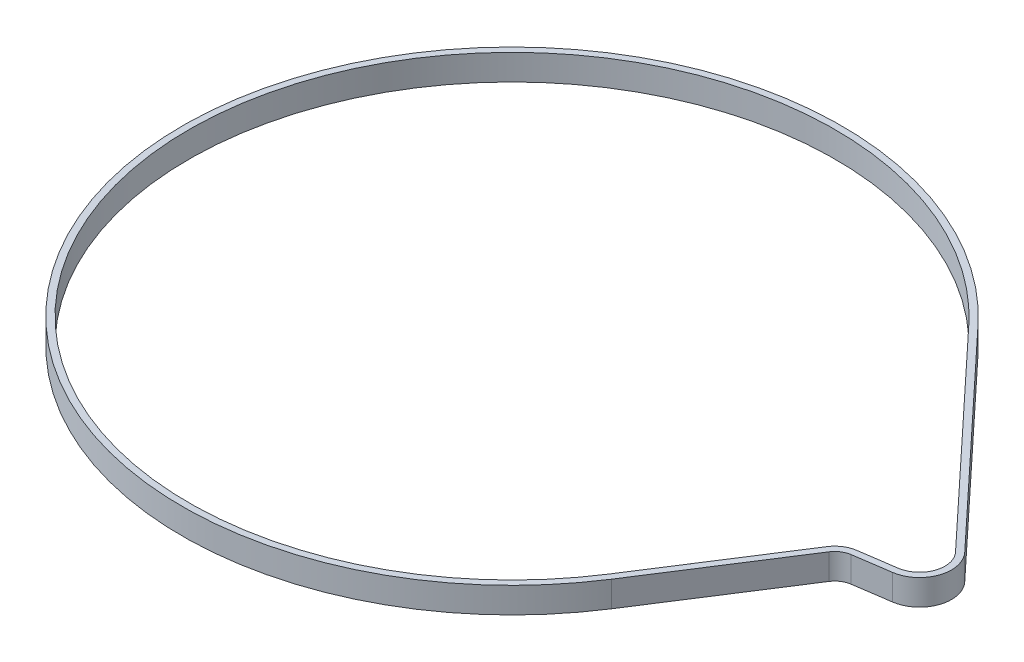
ISO-10303-21;
HEADER;
FILE_DESCRIPTION(('STEP AP214'),'2;1');
FILE_NAME('part.step','',(''),(''),'','','');
FILE_SCHEMA(('AUTOMOTIVE_DESIGN { 1 0 10303 214 1 1 1 1 }'));
ENDSEC;
DATA;
#1=APPLICATION_CONTEXT('core data for automotive mechanical design processes');
#2=APPLICATION_PROTOCOL_DEFINITION('international standard','automotive_design',2000,#1);
#3=PRODUCT_CONTEXT('',#1,'mechanical');
#4=PRODUCT('Part','Part','',(#3));
#5=PRODUCT_RELATED_PRODUCT_CATEGORY('part','',(#4));
#6=PRODUCT_DEFINITION_FORMATION('','',#4);
#7=PRODUCT_DEFINITION_CONTEXT('part definition',#1,'design');
#8=PRODUCT_DEFINITION('design','',#6,#7);
#9=PRODUCT_DEFINITION_SHAPE('','',#8);
#10=(LENGTH_UNIT() NAMED_UNIT(*) SI_UNIT(.MILLI.,.METRE.));
#11=(NAMED_UNIT(*) PLANE_ANGLE_UNIT() SI_UNIT($,.RADIAN.));
#12=(NAMED_UNIT(*) SI_UNIT($,.STERADIAN.) SOLID_ANGLE_UNIT());
#13=UNCERTAINTY_MEASURE_WITH_UNIT(LENGTH_MEASURE(1.E-05),#10,'distance_accuracy_value','');
#14=(GEOMETRIC_REPRESENTATION_CONTEXT(3) GLOBAL_UNCERTAINTY_ASSIGNED_CONTEXT((#13)) GLOBAL_UNIT_ASSIGNED_CONTEXT((#10,
#11,#12)) REPRESENTATION_CONTEXT('',''));
#15=CARTESIAN_POINT('',(0.,0.,0.));
#16=DIRECTION('',(0.,0.,1.));
#17=DIRECTION('',(1.,0.,0.));
#18=AXIS2_PLACEMENT_3D('',#15,#16,#17);
#19=CARTESIAN_POINT('',(158.877710673316,15.,102.032603113625));
#20=DIRECTION('',(-0.841426681760097,0.,-0.540371297555849));
#21=DIRECTION('',(-0.540371297555849,0.,0.841426681760097));
#22=AXIS2_PLACEMENT_3D('',#19,#20,#21);
#23=PLANE('',#22);
#24=DIRECTION('',(-0.540371297555849,0.,0.841426681760097));
#25=VECTOR('',#24,1.);
#26=CARTESIAN_POINT('',(208.605573561715,15.,24.6000102826151));
#27=LINE('',#26,#25);
#28=CARTESIAN_POINT('',(208.605573561715,15.,24.6000102826151));
#29=VERTEX_POINT('',#28);
#30=CARTESIAN_POINT('',(158.877710673316,15.,102.032603113625));
#31=VERTEX_POINT('',#30);
#32=EDGE_CURVE('E146',#29,#31,#27,.T.);
#33=ORIENTED_EDGE('',*,*,#32,.F.);
#34=DIRECTION('',(0.,-1.,0.));
#35=VECTOR('',#34,1.);
#36=CARTESIAN_POINT('',(208.605573561715,15.,24.600010282615));
#37=LINE('',#36,#35);
#38=CARTESIAN_POINT('',(208.605573561715,0.,24.6000102826151));
#39=VERTEX_POINT('',#38);
#40=EDGE_CURVE('E131',#39,#29,#37,.F.);
#41=ORIENTED_EDGE('',*,*,#40,.F.);
#42=DIRECTION('',(-0.540371297555849,0.,0.841426681760097));
#43=VECTOR('',#42,1.);
#44=CARTESIAN_POINT('',(208.605573561715,0.,24.6000102826151));
#45=LINE('',#44,#43);
#46=CARTESIAN_POINT('',(158.877710673316,0.,102.032603113625));
#47=VERTEX_POINT('',#46);
#48=EDGE_CURVE('E174',#39,#47,#45,.T.);
#49=ORIENTED_EDGE('',*,*,#48,.T.);
#50=DIRECTION('',(0.,-1.,0.));
#51=VECTOR('',#50,1.);
#52=CARTESIAN_POINT('',(158.877710673316,15.,102.032603113625));
#53=LINE('',#52,#51);
#54=EDGE_CURVE('E148',#47,#31,#53,.F.);
#55=ORIENTED_EDGE('',*,*,#54,.T.);
#56=EDGE_LOOP('',(#33,#41,#49,#55));
#57=FACE_BOUND('',#56,.T.);
#58=ADVANCED_FACE('F24',(#57),#23,.T.);
#59=CARTESIAN_POINT('',(0.,15.,0.));
#60=DIRECTION('',(0.,-1.,0.));
#61=DIRECTION('',(0.,0.,-1.));
#62=AXIS2_PLACEMENT_3D('',#59,#60,#61);
#63=CYLINDRICAL_SURFACE('',#62,188.819435035);
#64=CARTESIAN_POINT('',(0.,15.,0.));
#65=DIRECTION('',(0.,-1.,0.));
#66=DIRECTION('',(0.,0.,-1.));
#67=AXIS2_PLACEMENT_3D('',#64,#65,#66);
#68=CIRCLE('',#67,188.819435035);
#69=CARTESIAN_POINT('',(137.940623881372,15.,-128.938602947893));
#70=VERTEX_POINT('',#69);
#71=EDGE_CURVE('E152',#31,#70,#68,.T.);
#72=ORIENTED_EDGE('',*,*,#71,.F.);
#73=ORIENTED_EDGE('',*,*,#54,.F.);
#74=CARTESIAN_POINT('',(0.,0.,0.));
#75=DIRECTION('',(0.,-1.,0.));
#76=DIRECTION('',(0.,0.,-1.));
#77=AXIS2_PLACEMENT_3D('',#74,#75,#76);
#78=CIRCLE('',#77,188.819435035);
#79=CARTESIAN_POINT('',(137.940623881372,0.,-128.938602947893));
#80=VERTEX_POINT('',#79);
#81=EDGE_CURVE('E212',#47,#80,#78,.T.);
#82=ORIENTED_EDGE('',*,*,#81,.T.);
#83=DIRECTION('',(0.,1.,0.));
#84=VECTOR('',#83,1.);
#85=CARTESIAN_POINT('',(137.940623881373,15.,-128.938602947892));
#86=LINE('',#85,#84);
#87=EDGE_CURVE('E192',#80,#70,#86,.T.);
#88=ORIENTED_EDGE('',*,*,#87,.T.);
#89=EDGE_LOOP('',(#72,#73,#82,#88));
#90=FACE_BOUND('',#89,.T.);
#91=ADVANCED_FACE('F286',(#90),#63,.F.);
#92=CARTESIAN_POINT('',(137.940623881371,15.,-128.938602947894));
#93=DIRECTION('',(0.730542509333333,0.,-0.6828672213959));
#94=DIRECTION('',(-0.6828672213959,0.,-0.730542509333333));
#95=AXIS2_PLACEMENT_3D('',#92,#93,#94);
#96=PLANE('',#95);
#97=DIRECTION('',(0.,-1.,0.));
#98=VECTOR('',#97,1.);
#99=CARTESIAN_POINT('',(248.980131146184,15.,-10.1467240427216));
#100=LINE('',#99,#98);
#101=CARTESIAN_POINT('',(248.980131146184,0.,-10.1467240427217));
#102=VERTEX_POINT('',#101);
#103=CARTESIAN_POINT('',(248.980131146184,15.,-10.1467240427217));
#104=VERTEX_POINT('',#103);
#105=EDGE_CURVE('E189',#102,#104,#100,.F.);
#106=ORIENTED_EDGE('',*,*,#105,.T.);
#107=DIRECTION('',(0.6828672213959,0.,0.730542509333333));
#108=VECTOR('',#107,1.);
#109=CARTESIAN_POINT('',(137.940623881373,15.,-128.938602947892));
#110=LINE('',#109,#108);
#111=EDGE_CURVE('E226',#70,#104,#110,.T.);
#112=ORIENTED_EDGE('',*,*,#111,.F.);
#113=ORIENTED_EDGE('',*,*,#87,.F.);
#114=DIRECTION('',(0.6828672213959,0.,0.730542509333333));
#115=VECTOR('',#114,1.);
#116=CARTESIAN_POINT('',(137.940623881373,0.,-128.938602947892));
#117=LINE('',#116,#115);
#118=EDGE_CURVE('E211',#80,#102,#117,.T.);
#119=ORIENTED_EDGE('',*,*,#118,.T.);
#120=EDGE_LOOP('',(#106,#112,#113,#119));
#121=FACE_BOUND('',#120,.T.);
#122=ADVANCED_FACE('F299',(#121),#96,.F.);
#123=CARTESIAN_POINT('',(238.125,15.,0.));
#124=DIRECTION('',(0.,-1.,0.));
#125=DIRECTION('',(0.,0.,-1.));
#126=AXIS2_PLACEMENT_3D('',#123,#124,#125);
#127=CYLINDRICAL_SURFACE('',#126,14.8589999999999);
#128=DIRECTION('',(0.,1.,0.));
#129=VECTOR('',#128,1.);
#130=CARTESIAN_POINT('',(240.272744877639,15.,14.7029613663566));
#131=LINE('',#130,#129);
#132=CARTESIAN_POINT('',(240.272744877639,15.,14.7029613663566));
#133=VERTEX_POINT('',#132);
#134=CARTESIAN_POINT('',(240.272744877639,0.,14.7029613663566));
#135=VERTEX_POINT('',#134);
#136=EDGE_CURVE('E142',#133,#135,#131,.F.);
#137=ORIENTED_EDGE('',*,*,#136,.F.);
#138=CARTESIAN_POINT('',(238.125,15.,0.));
#139=DIRECTION('',(0.,-1.,0.));
#140=DIRECTION('',(0.,0.,-1.));
#141=AXIS2_PLACEMENT_3D('',#138,#139,#140);
#142=CIRCLE('',#141,14.8589999999999);
#143=EDGE_CURVE('E224',#104,#133,#142,.T.);
#144=ORIENTED_EDGE('',*,*,#143,.F.);
#145=ORIENTED_EDGE('',*,*,#105,.F.);
#146=CARTESIAN_POINT('',(238.125,0.,0.));
#147=DIRECTION('',(0.,-1.,0.));
#148=DIRECTION('',(0.,0.,-1.));
#149=AXIS2_PLACEMENT_3D('',#146,#147,#148);
#150=CIRCLE('',#149,14.8589999999999);
#151=EDGE_CURVE('E208',#102,#135,#150,.T.);
#152=ORIENTED_EDGE('',*,*,#151,.T.);
#153=EDGE_LOOP('',(#137,#144,#145,#152));
#154=FACE_BOUND('',#153,.T.);
#155=ADVANCED_FACE('F307',(#154),#127,.F.);
#156=CARTESIAN_POINT('',(7.1227234145852,15.,48.7605060909451));
#157=DIRECTION('',(-0.144541683669059,0.,-0.989498712319583));
#158=DIRECTION('',(-0.989498712319583,0.,0.144541683669059));
#159=AXIS2_PLACEMENT_3D('',#156,#157,#158);
#160=PLANE('',#159);
#161=DIRECTION('',(-0.989498712319584,0.,0.144541683669059));
#162=VECTOR('',#161,1.);
#163=CARTESIAN_POINT('',(240.272744877639,15.,14.7029613663566));
#164=LINE('',#163,#162);
#165=CARTESIAN_POINT('',(219.181848735244,15.,17.7838280724533));
#166=VERTEX_POINT('',#165);
#167=EDGE_CURVE('E156',#133,#166,#164,.T.);
#168=ORIENTED_EDGE('',*,*,#167,.F.);
#169=ORIENTED_EDGE('',*,*,#136,.T.);
#170=DIRECTION('',(-0.989498712319584,0.,0.144541683669059));
#171=VECTOR('',#170,1.);
#172=CARTESIAN_POINT('',(240.272744877639,0.,14.7029613663566));
#173=LINE('',#172,#171);
#174=CARTESIAN_POINT('',(219.181848735244,0.,17.7838280724533));
#175=VERTEX_POINT('',#174);
#176=EDGE_CURVE('E207',#135,#175,#173,.T.);
#177=ORIENTED_EDGE('',*,*,#176,.T.);
#178=DIRECTION('',(0.,-1.,0.));
#179=VECTOR('',#178,1.);
#180=CARTESIAN_POINT('',(219.181848735244,15.,17.7838280724533));
#181=LINE('',#180,#179);
#182=EDGE_CURVE('E125',#166,#175,#181,.T.);
#183=ORIENTED_EDGE('',*,*,#182,.F.);
#184=EDGE_LOOP('',(#168,#169,#177,#183));
#185=FACE_BOUND('',#184,.T.);
#186=ADVANCED_FACE('F318',(#185),#160,.T.);
#187=CARTESIAN_POINT('',(221.375485597447,15.,32.8009552799714));
#188=DIRECTION('',(0.,-1.,0.));
#189=DIRECTION('',(0.,0.,-1.));
#190=AXIS2_PLACEMENT_3D('',#187,#188,#189);
#191=CYLINDRICAL_SURFACE('',#190,15.1765);
#192=CARTESIAN_POINT('',(221.375485597447,15.,32.8009552799714));
#193=DIRECTION('',(0.,-1.,0.));
#194=DIRECTION('',(0.,0.,-1.));
#195=AXIS2_PLACEMENT_3D('',#192,#193,#194);
#196=CIRCLE('',#195,15.1765);
#197=EDGE_CURVE('E27',#166,#29,#196,.F.);
#198=ORIENTED_EDGE('',*,*,#197,.F.);
#199=ORIENTED_EDGE('',*,*,#182,.T.);
#200=CARTESIAN_POINT('',(221.375485597447,0.,32.8009552799714));
#201=DIRECTION('',(0.,-1.,0.));
#202=DIRECTION('',(0.,0.,-1.));
#203=AXIS2_PLACEMENT_3D('',#200,#201,#202);
#204=CIRCLE('',#203,15.1765);
#205=EDGE_CURVE('E137',#175,#39,#204,.F.);
#206=ORIENTED_EDGE('',*,*,#205,.T.);
#207=ORIENTED_EDGE('',*,*,#40,.T.);
#208=EDGE_LOOP('',(#198,#199,#206,#207));
#209=FACE_BOUND('',#208,.T.);
#210=ADVANCED_FACE('F133',(#209),#191,.T.);
#211=CARTESIAN_POINT('',(7.67342722936378,15.,52.5304961848814));
#212=DIRECTION('',(-0.144541683669053,0.,-0.989498712319584));
#213=DIRECTION('',(-0.989498712319584,0.,0.144541683669053));
#214=AXIS2_PLACEMENT_3D('',#211,#212,#213);
#215=PLANE('',#214);
#216=DIRECTION('',(0.,-1.,0.));
#217=VECTOR('',#216,1.);
#218=CARTESIAN_POINT('',(240.823448692418,15.,18.4729514602943));
#219=LINE('',#218,#217);
#220=CARTESIAN_POINT('',(240.823448692418,15.,18.4729514602943));
#221=VERTEX_POINT('',#220);
#222=CARTESIAN_POINT('',(240.823448692418,0.,18.4729514602943));
#223=VERTEX_POINT('',#222);
#224=EDGE_CURVE('E180',#221,#223,#219,.T.);
#225=ORIENTED_EDGE('',*,*,#224,.F.);
#226=DIRECTION('',(0.989498712319584,0.,-0.144541683669053));
#227=VECTOR('',#226,1.);
#228=CARTESIAN_POINT('',(219.732552550023,15.,21.5538181663909));
#229=LINE('',#228,#227);
#230=CARTESIAN_POINT('',(219.732552550023,15.,21.5538181663909));
#231=VERTEX_POINT('',#230);
#232=EDGE_CURVE('E219',#231,#221,#229,.T.);
#233=ORIENTED_EDGE('',*,*,#232,.F.);
#234=DIRECTION('',(0.,-1.,0.));
#235=VECTOR('',#234,1.);
#236=CARTESIAN_POINT('',(219.732552550023,15.,21.5538181663909));
#237=LINE('',#236,#235);
#238=CARTESIAN_POINT('',(219.732552550023,0.,21.5538181663909));
#239=VERTEX_POINT('',#238);
#240=EDGE_CURVE('E162',#231,#239,#237,.T.);
#241=ORIENTED_EDGE('',*,*,#240,.T.);
#242=DIRECTION('',(0.989498712319584,0.,-0.144541683669053));
#243=VECTOR('',#242,1.);
#244=CARTESIAN_POINT('',(219.732552550023,0.,21.5538181663909));
#245=LINE('',#244,#243);
#246=EDGE_CURVE('E204',#239,#223,#245,.T.);
#247=ORIENTED_EDGE('',*,*,#246,.T.);
#248=EDGE_LOOP('',(#225,#233,#241,#247));
#249=FACE_BOUND('',#248,.T.);
#250=ADVANCED_FACE('F333',(#249),#215,.F.);
#251=CARTESIAN_POINT('',(238.125,15.,0.));
#252=DIRECTION('',(0.,-1.,0.));
#253=DIRECTION('',(0.,0.,-1.));
#254=AXIS2_PLACEMENT_3D('',#251,#252,#253);
#255=CYLINDRICAL_SURFACE('',#254,18.669);
#256=CARTESIAN_POINT('',(238.125,15.,0.));
#257=DIRECTION('',(0.,-1.,0.));
#258=DIRECTION('',(0.,0.,-1.));
#259=AXIS2_PLACEMENT_3D('',#256,#257,#258);
#260=CIRCLE('',#259,18.669);
#261=CARTESIAN_POINT('',(251.763498106744,15.,-12.74844815624));
#262=VERTEX_POINT('',#261);
#263=EDGE_CURVE('E214',#221,#262,#260,.F.);
#264=ORIENTED_EDGE('',*,*,#263,.F.);
#265=ORIENTED_EDGE('',*,*,#224,.T.);
#266=CARTESIAN_POINT('',(238.125,0.,0.));
#267=DIRECTION('',(0.,-1.,0.));
#268=DIRECTION('',(0.,0.,-1.));
#269=AXIS2_PLACEMENT_3D('',#266,#267,#268);
#270=CIRCLE('',#269,18.669);
#271=CARTESIAN_POINT('',(251.763498106744,0.,-12.74844815624));
#272=VERTEX_POINT('',#271);
#273=EDGE_CURVE('E200',#223,#272,#270,.F.);
#274=ORIENTED_EDGE('',*,*,#273,.T.);
#275=DIRECTION('',(0.,1.,0.));
#276=VECTOR('',#275,1.);
#277=CARTESIAN_POINT('',(251.763498106744,15.,-12.74844815624));
#278=LINE('',#277,#276);
#279=EDGE_CURVE('E176',#262,#272,#278,.F.);
#280=ORIENTED_EDGE('',*,*,#279,.F.);
#281=EDGE_LOOP('',(#264,#265,#274,#280));
#282=FACE_BOUND('',#281,.T.);
#283=ADVANCED_FACE('F340',(#282),#255,.T.);
#284=CARTESIAN_POINT('',(140.723990841931,15.,-131.540327061412));
#285=DIRECTION('',(0.730542509333333,0.,-0.6828672213959));
#286=DIRECTION('',(-0.6828672213959,0.,-0.730542509333333));
#287=AXIS2_PLACEMENT_3D('',#284,#285,#286);
#288=PLANE('',#287);
#289=DIRECTION('',(-0.6828672213959,0.,-0.730542509333333));
#290=VECTOR('',#289,1.);
#291=CARTESIAN_POINT('',(251.763498106744,15.,-12.74844815624));
#292=LINE('',#291,#290);
#293=CARTESIAN_POINT('',(140.723990841932,15.,-131.540327061411));
#294=VERTEX_POINT('',#293);
#295=EDGE_CURVE('E218',#262,#294,#292,.T.);
#296=ORIENTED_EDGE('',*,*,#295,.F.);
#297=ORIENTED_EDGE('',*,*,#279,.T.);
#298=DIRECTION('',(-0.6828672213959,0.,-0.730542509333333));
#299=VECTOR('',#298,1.);
#300=CARTESIAN_POINT('',(251.763498106744,0.,-12.74844815624));
#301=LINE('',#300,#299);
#302=CARTESIAN_POINT('',(140.723990841932,0.,-131.540327061411));
#303=VERTEX_POINT('',#302);
#304=EDGE_CURVE('E203',#272,#303,#301,.T.);
#305=ORIENTED_EDGE('',*,*,#304,.T.);
#306=DIRECTION('',(0.,-1.,0.));
#307=VECTOR('',#306,1.);
#308=CARTESIAN_POINT('',(140.723990841933,15.,-131.540327061411));
#309=LINE('',#308,#307);
#310=EDGE_CURVE('E171',#294,#303,#309,.T.);
#311=ORIENTED_EDGE('',*,*,#310,.F.);
#312=EDGE_LOOP('',(#296,#297,#305,#311));
#313=FACE_BOUND('',#312,.T.);
#314=ADVANCED_FACE('F349',(#313),#288,.T.);
#315=CARTESIAN_POINT('',(162.083546330822,15.,104.091417757313));
#316=DIRECTION('',(-0.841426681760097,0.,-0.540371297555849));
#317=DIRECTION('',(-0.540371297555849,0.,0.841426681760097));
#318=AXIS2_PLACEMENT_3D('',#315,#316,#317);
#319=PLANE('',#318);
#320=DIRECTION('',(0.,-1.,0.));
#321=VECTOR('',#320,1.);
#322=CARTESIAN_POINT('',(211.811409219221,15.,26.6588249263029));
#323=LINE('',#322,#321);
#324=CARTESIAN_POINT('',(211.811409219221,0.,26.6588249263029));
#325=VERTEX_POINT('',#324);
#326=CARTESIAN_POINT('',(211.811409219221,15.,26.6588249263029));
#327=VERTEX_POINT('',#326);
#328=EDGE_CURVE('E167',#325,#327,#323,.F.);
#329=ORIENTED_EDGE('',*,*,#328,.T.);
#330=DIRECTION('',(0.540371297555849,0.,-0.841426681760098));
#331=VECTOR('',#330,1.);
#332=CARTESIAN_POINT('',(162.083546330822,15.,104.091417757313));
#333=LINE('',#332,#331);
#334=CARTESIAN_POINT('',(162.083546330822,15.,104.091417757313));
#335=VERTEX_POINT('',#334);
#336=EDGE_CURVE('E175',#335,#327,#333,.T.);
#337=ORIENTED_EDGE('',*,*,#336,.F.);
#338=DIRECTION('',(0.,-1.,0.));
#339=VECTOR('',#338,1.);
#340=CARTESIAN_POINT('',(162.083546330822,15.,104.091417757313));
#341=LINE('',#340,#339);
#342=CARTESIAN_POINT('',(162.083546330822,0.,104.091417757313));
#343=VERTEX_POINT('',#342);
#344=EDGE_CURVE('E158',#343,#335,#341,.F.);
#345=ORIENTED_EDGE('',*,*,#344,.F.);
#346=DIRECTION('',(0.540371297555849,0.,-0.841426681760098));
#347=VECTOR('',#346,1.);
#348=CARTESIAN_POINT('',(162.083546330822,0.,104.091417757313));
#349=LINE('',#348,#347);
#350=EDGE_CURVE('E47',#343,#325,#349,.T.);
#351=ORIENTED_EDGE('',*,*,#350,.T.);
#352=EDGE_LOOP('',(#329,#337,#345,#351));
#353=FACE_BOUND('',#352,.T.);
#354=ADVANCED_FACE('F358',(#353),#319,.F.);
#355=CARTESIAN_POINT('',(221.375485597447,15.,32.8009552799714));
#356=DIRECTION('',(0.,-1.,0.));
#357=DIRECTION('',(0.,0.,-1.));
#358=AXIS2_PLACEMENT_3D('',#355,#356,#357);
#359=CYLINDRICAL_SURFACE('',#358,11.3665);
#360=ORIENTED_EDGE('',*,*,#240,.F.);
#361=CARTESIAN_POINT('',(221.375485597447,15.,32.8009552799714));
#362=DIRECTION('',(0.,-1.,0.));
#363=DIRECTION('',(0.,0.,-1.));
#364=AXIS2_PLACEMENT_3D('',#361,#362,#363);
#365=CIRCLE('',#364,11.3665);
#366=EDGE_CURVE('E220',#327,#231,#365,.T.);
#367=ORIENTED_EDGE('',*,*,#366,.F.);
#368=ORIENTED_EDGE('',*,*,#328,.F.);
#369=CARTESIAN_POINT('',(221.375485597447,0.,32.8009552799714));
#370=DIRECTION('',(0.,-1.,0.));
#371=DIRECTION('',(0.,0.,-1.));
#372=AXIS2_PLACEMENT_3D('',#369,#370,#371);
#373=CIRCLE('',#372,11.3665);
#374=EDGE_CURVE('E196',#325,#239,#373,.T.);
#375=ORIENTED_EDGE('',*,*,#374,.T.);
#376=EDGE_LOOP('',(#360,#367,#368,#375));
#377=FACE_BOUND('',#376,.T.);
#378=ADVANCED_FACE('F366',(#377),#359,.F.);
#379=CARTESIAN_POINT('',(0.,15.,0.));
#380=DIRECTION('',(0.,1.,0.));
#381=DIRECTION('',(0.,0.,1.));
#382=AXIS2_PLACEMENT_3D('',#379,#380,#381);
#383=PLANE('',#382);
#384=CARTESIAN_POINT('',(0.,15.,0.));
#385=DIRECTION('',(0.,-1.,0.));
#386=DIRECTION('',(0.,0.,-1.));
#387=AXIS2_PLACEMENT_3D('',#384,#385,#386);
#388=CIRCLE('',#387,192.629435035);
#389=EDGE_CURVE('E34',#335,#294,#388,.T.);
#390=ORIENTED_EDGE('',*,*,#389,.F.);
#391=ORIENTED_EDGE('',*,*,#336,.T.);
#392=ORIENTED_EDGE('',*,*,#366,.T.);
#393=ORIENTED_EDGE('',*,*,#232,.T.);
#394=ORIENTED_EDGE('',*,*,#263,.T.);
#395=ORIENTED_EDGE('',*,*,#295,.T.);
#396=EDGE_LOOP('',(#390,#391,#392,#393,#394,#395));
#397=FACE_BOUND('',#396,.T.);
#398=ORIENTED_EDGE('',*,*,#143,.T.);
#399=ORIENTED_EDGE('',*,*,#167,.T.);
#400=ORIENTED_EDGE('',*,*,#197,.T.);
#401=ORIENTED_EDGE('',*,*,#32,.T.);
#402=ORIENTED_EDGE('',*,*,#71,.T.);
#403=ORIENTED_EDGE('',*,*,#111,.T.);
#404=EDGE_LOOP('',(#398,#399,#400,#401,#402,#403));
#405=FACE_BOUND('',#404,.T.);
#406=ADVANCED_FACE('F155',(#397,#405),#383,.T.);
#407=CARTESIAN_POINT('',(0.,0.,0.));
#408=DIRECTION('',(0.,1.,0.));
#409=DIRECTION('',(0.,0.,1.));
#410=AXIS2_PLACEMENT_3D('',#407,#408,#409);
#411=PLANE('',#410);
#412=ORIENTED_EDGE('',*,*,#350,.F.);
#413=CARTESIAN_POINT('',(0.,0.,0.));
#414=DIRECTION('',(0.,-1.,0.));
#415=DIRECTION('',(0.,0.,-1.));
#416=AXIS2_PLACEMENT_3D('',#413,#414,#415);
#417=CIRCLE('',#416,192.629435035);
#418=EDGE_CURVE('E13',#303,#343,#417,.F.);
#419=ORIENTED_EDGE('',*,*,#418,.F.);
#420=ORIENTED_EDGE('',*,*,#304,.F.);
#421=ORIENTED_EDGE('',*,*,#273,.F.);
#422=ORIENTED_EDGE('',*,*,#246,.F.);
#423=ORIENTED_EDGE('',*,*,#374,.F.);
#424=EDGE_LOOP('',(#412,#419,#420,#421,#422,#423));
#425=FACE_BOUND('',#424,.T.);
#426=ORIENTED_EDGE('',*,*,#176,.F.);
#427=ORIENTED_EDGE('',*,*,#151,.F.);
#428=ORIENTED_EDGE('',*,*,#118,.F.);
#429=ORIENTED_EDGE('',*,*,#81,.F.);
#430=ORIENTED_EDGE('',*,*,#48,.F.);
#431=ORIENTED_EDGE('',*,*,#205,.F.);
#432=EDGE_LOOP('',(#426,#427,#428,#429,#430,#431));
#433=FACE_BOUND('',#432,.T.);
#434=ADVANCED_FACE('F274',(#425,#433),#411,.F.);
#435=CARTESIAN_POINT('',(0.,15.,0.));
#436=DIRECTION('',(0.,-1.,0.));
#437=DIRECTION('',(0.,0.,-1.));
#438=AXIS2_PLACEMENT_3D('',#435,#436,#437);
#439=CYLINDRICAL_SURFACE('',#438,192.629435035);
#440=ORIENTED_EDGE('',*,*,#389,.T.);
#441=ORIENTED_EDGE('',*,*,#310,.T.);
#442=ORIENTED_EDGE('',*,*,#418,.T.);
#443=ORIENTED_EDGE('',*,*,#344,.T.);
#444=EDGE_LOOP('',(#440,#441,#442,#443));
#445=FACE_BOUND('',#444,.T.);
#446=ADVANCED_FACE('F271',(#445),#439,.T.);
#447=CLOSED_SHELL('',(#58,#91,#122,#155,#186,#210,#250,#283,#314,#354,#378,#406,#434,#446));
#448=MANIFOLD_SOLID_BREP('B1',#447);
#449=ADVANCED_BREP_SHAPE_REPRESENTATION('',(#18,#448),#14);
#450=SHAPE_DEFINITION_REPRESENTATION(#9,#449);
ENDSEC;
END-ISO-10303-21;
